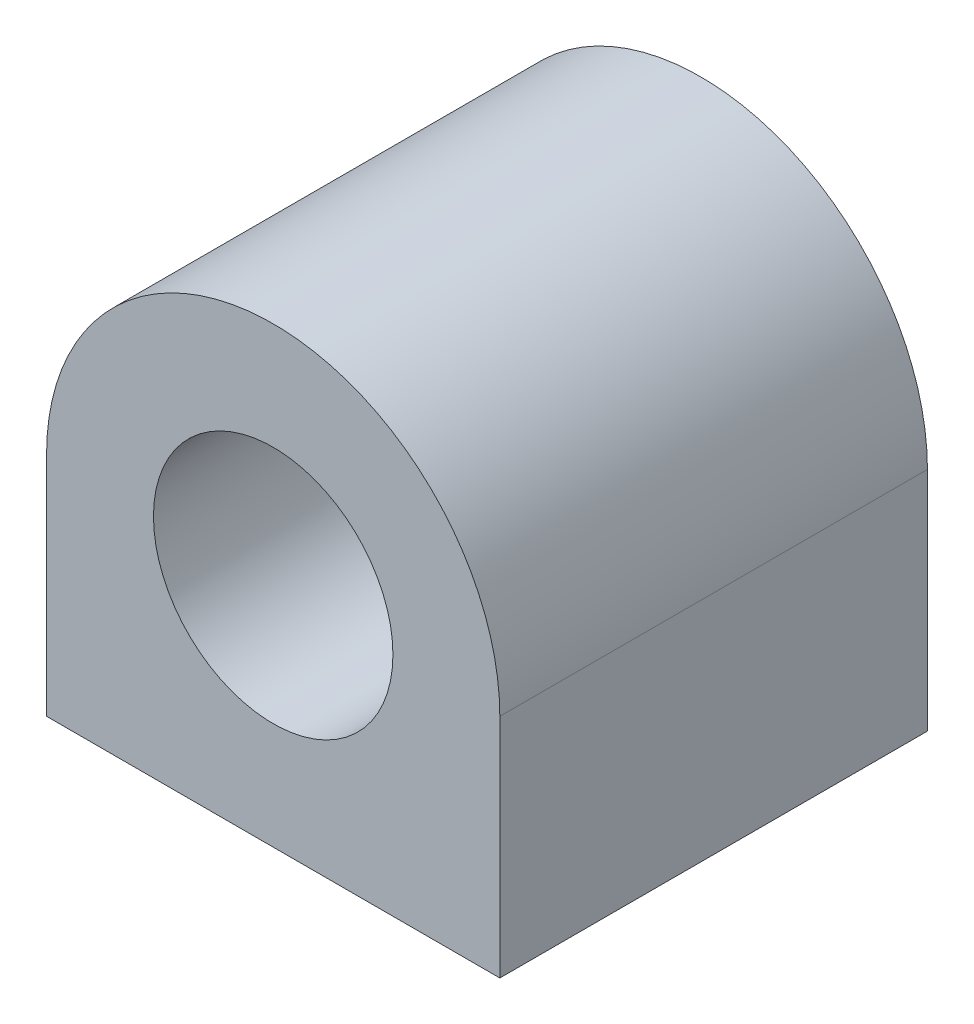
ISO-10303-21;
HEADER;
FILE_DESCRIPTION(('STEP AP214'),'2;1');
FILE_NAME('part.step','',(''),(''),'','','');
FILE_SCHEMA(('AUTOMOTIVE_DESIGN { 1 0 10303 214 1 1 1 1 }'));
ENDSEC;
DATA;
#1=APPLICATION_CONTEXT('core data for automotive mechanical design processes');
#2=APPLICATION_PROTOCOL_DEFINITION('international standard','automotive_design',2000,#1);
#3=PRODUCT_CONTEXT('',#1,'mechanical');
#4=PRODUCT('Part','Part','',(#3));
#5=PRODUCT_RELATED_PRODUCT_CATEGORY('part','',(#4));
#6=PRODUCT_DEFINITION_FORMATION('','',#4);
#7=PRODUCT_DEFINITION_CONTEXT('part definition',#1,'design');
#8=PRODUCT_DEFINITION('design','',#6,#7);
#9=PRODUCT_DEFINITION_SHAPE('','',#8);
#10=(LENGTH_UNIT() NAMED_UNIT(*) SI_UNIT(.MILLI.,.METRE.));
#11=(NAMED_UNIT(*) PLANE_ANGLE_UNIT() SI_UNIT($,.RADIAN.));
#12=(NAMED_UNIT(*) SI_UNIT($,.STERADIAN.) SOLID_ANGLE_UNIT());
#13=UNCERTAINTY_MEASURE_WITH_UNIT(LENGTH_MEASURE(1.E-05),#10,'distance_accuracy_value','');
#14=(GEOMETRIC_REPRESENTATION_CONTEXT(3) GLOBAL_UNCERTAINTY_ASSIGNED_CONTEXT((#13)) GLOBAL_UNIT_ASSIGNED_CONTEXT((#10,
#11,#12)) REPRESENTATION_CONTEXT('',''));
#15=CARTESIAN_POINT('',(0.,0.,0.));
#16=DIRECTION('',(0.,0.,1.));
#17=DIRECTION('',(1.,0.,0.));
#18=AXIS2_PLACEMENT_3D('',#15,#16,#17);
#19=CARTESIAN_POINT('',(0.,0.,10.));
#20=DIRECTION('',(0.,0.,1.));
#21=DIRECTION('',(1.,0.,0.));
#22=AXIS2_PLACEMENT_3D('',#19,#20,#21);
#23=PLANE('',#22);
#24=CARTESIAN_POINT('',(0.,0.,10.));
#25=DIRECTION('',(0.,0.,1.));
#26=DIRECTION('',(1.,0.,0.));
#27=AXIS2_PLACEMENT_3D('',#24,#25,#26);
#28=CIRCLE('',#27,10.6);
#29=CARTESIAN_POINT('',(10.6,0.,10.));
#30=VERTEX_POINT('',#29);
#31=CARTESIAN_POINT('',(-10.6,0.,10.));
#32=VERTEX_POINT('',#31);
#33=EDGE_CURVE('E85',#30,#32,#28,.T.);
#34=ORIENTED_EDGE('',*,*,#33,.T.);
#35=DIRECTION('',(0.,-1.,0.));
#36=VECTOR('',#35,1.);
#37=CARTESIAN_POINT('',(-10.6,0.,10.));
#38=LINE('',#37,#36);
#39=CARTESIAN_POINT('',(-10.6,-10.6,10.));
#40=VERTEX_POINT('',#39);
#41=EDGE_CURVE('E80',#32,#40,#38,.T.);
#42=ORIENTED_EDGE('',*,*,#41,.T.);
#43=DIRECTION('',(1.,0.,0.));
#44=VECTOR('',#43,1.);
#45=CARTESIAN_POINT('',(-10.6,-10.6,10.));
#46=LINE('',#45,#44);
#47=CARTESIAN_POINT('',(10.6,-10.6,10.));
#48=VERTEX_POINT('',#47);
#49=EDGE_CURVE('E83',#40,#48,#46,.T.);
#50=ORIENTED_EDGE('',*,*,#49,.T.);
#51=DIRECTION('',(0.,1.,0.));
#52=VECTOR('',#51,1.);
#53=CARTESIAN_POINT('',(10.6,-10.6,10.));
#54=LINE('',#53,#52);
#55=EDGE_CURVE('E50',#48,#30,#54,.T.);
#56=ORIENTED_EDGE('',*,*,#55,.T.);
#57=EDGE_LOOP('',(#34,#42,#50,#56));
#58=FACE_BOUND('',#57,.T.);
#59=CARTESIAN_POINT('',(0.,0.,10.));
#60=DIRECTION('',(0.,0.,1.));
#61=DIRECTION('',(1.,0.,0.));
#62=AXIS2_PLACEMENT_3D('',#59,#60,#61);
#63=CIRCLE('',#62,5.6);
#64=CARTESIAN_POINT('',(5.6,0.,10.));
#65=VERTEX_POINT('',#64);
#66=EDGE_CURVE('E100',#65,#65,#63,.T.);
#67=ORIENTED_EDGE('',*,*,#66,.F.);
#68=EDGE_LOOP('',(#67));
#69=FACE_BOUND('',#68,.T.);
#70=ADVANCED_FACE('F33',(#58,#69),#23,.T.);
#71=CARTESIAN_POINT('',(0.,0.,-10.));
#72=DIRECTION('',(0.,0.,1.));
#73=DIRECTION('',(1.,0.,0.));
#74=AXIS2_PLACEMENT_3D('',#71,#72,#73);
#75=PLANE('',#74);
#76=CARTESIAN_POINT('',(0.,0.,-10.));
#77=DIRECTION('',(0.,0.,1.));
#78=DIRECTION('',(1.,0.,0.));
#79=AXIS2_PLACEMENT_3D('',#76,#77,#78);
#80=CIRCLE('',#79,10.6);
#81=CARTESIAN_POINT('',(10.6,0.,-10.));
#82=VERTEX_POINT('',#81);
#83=CARTESIAN_POINT('',(-10.6,0.,-10.));
#84=VERTEX_POINT('',#83);
#85=EDGE_CURVE('E97',#82,#84,#80,.T.);
#86=ORIENTED_EDGE('',*,*,#85,.F.);
#87=DIRECTION('',(0.,1.,0.));
#88=VECTOR('',#87,1.);
#89=CARTESIAN_POINT('',(10.6,-10.6,-10.));
#90=LINE('',#89,#88);
#91=CARTESIAN_POINT('',(10.6,-10.6,-10.));
#92=VERTEX_POINT('',#91);
#93=EDGE_CURVE('E73',#92,#82,#90,.T.);
#94=ORIENTED_EDGE('',*,*,#93,.F.);
#95=DIRECTION('',(1.,0.,0.));
#96=VECTOR('',#95,1.);
#97=CARTESIAN_POINT('',(-10.6,-10.6,-10.));
#98=LINE('',#97,#96);
#99=CARTESIAN_POINT('',(-10.6,-10.6,-10.));
#100=VERTEX_POINT('',#99);
#101=EDGE_CURVE('E67',#100,#92,#98,.T.);
#102=ORIENTED_EDGE('',*,*,#101,.F.);
#103=DIRECTION('',(0.,-1.,0.));
#104=VECTOR('',#103,1.);
#105=CARTESIAN_POINT('',(-10.6,0.,-10.));
#106=LINE('',#105,#104);
#107=EDGE_CURVE('E89',#84,#100,#106,.T.);
#108=ORIENTED_EDGE('',*,*,#107,.F.);
#109=EDGE_LOOP('',(#86,#94,#102,#108));
#110=FACE_BOUND('',#109,.T.);
#111=CARTESIAN_POINT('',(0.,0.,-10.));
#112=DIRECTION('',(0.,0.,1.));
#113=DIRECTION('',(1.,0.,0.));
#114=AXIS2_PLACEMENT_3D('',#111,#112,#113);
#115=CIRCLE('',#114,5.6);
#116=CARTESIAN_POINT('',(5.6,0.,-10.));
#117=VERTEX_POINT('',#116);
#118=EDGE_CURVE('E112',#117,#117,#115,.T.);
#119=ORIENTED_EDGE('',*,*,#118,.T.);
#120=EDGE_LOOP('',(#119));
#121=FACE_BOUND('',#120,.T.);
#122=ADVANCED_FACE('F108',(#110,#121),#75,.F.);
#123=CARTESIAN_POINT('',(0.,0.,10.));
#124=DIRECTION('',(0.,0.,-1.));
#125=DIRECTION('',(-1.,0.,0.));
#126=AXIS2_PLACEMENT_3D('',#123,#124,#125);
#127=CYLINDRICAL_SURFACE('',#126,10.6);
#128=ORIENTED_EDGE('',*,*,#85,.T.);
#129=DIRECTION('',(0.,0.,-1.));
#130=VECTOR('',#129,1.);
#131=CARTESIAN_POINT('',(-10.6,0.,10.));
#132=LINE('',#131,#130);
#133=EDGE_CURVE('E11',#32,#84,#132,.T.);
#134=ORIENTED_EDGE('',*,*,#133,.F.);
#135=ORIENTED_EDGE('',*,*,#33,.F.);
#136=DIRECTION('',(0.,0.,-1.));
#137=VECTOR('',#136,1.);
#138=CARTESIAN_POINT('',(10.6,0.,10.));
#139=LINE('',#138,#137);
#140=EDGE_CURVE('E93',#30,#82,#139,.T.);
#141=ORIENTED_EDGE('',*,*,#140,.T.);
#142=EDGE_LOOP('',(#128,#134,#135,#141));
#143=FACE_BOUND('',#142,.T.);
#144=ADVANCED_FACE('F35',(#143),#127,.T.);
#145=CARTESIAN_POINT('',(-10.6,0.,10.));
#146=DIRECTION('',(1.,0.,0.));
#147=DIRECTION('',(0.,1.,0.));
#148=AXIS2_PLACEMENT_3D('',#145,#146,#147);
#149=PLANE('',#148);
#150=ORIENTED_EDGE('',*,*,#107,.T.);
#151=DIRECTION('',(0.,0.,-1.));
#152=VECTOR('',#151,1.);
#153=CARTESIAN_POINT('',(-10.6,-10.6,10.));
#154=LINE('',#153,#152);
#155=EDGE_CURVE('E42',#40,#100,#154,.T.);
#156=ORIENTED_EDGE('',*,*,#155,.F.);
#157=ORIENTED_EDGE('',*,*,#41,.F.);
#158=ORIENTED_EDGE('',*,*,#133,.T.);
#159=EDGE_LOOP('',(#150,#156,#157,#158));
#160=FACE_BOUND('',#159,.T.);
#161=ADVANCED_FACE('F88',(#160),#149,.F.);
#162=CARTESIAN_POINT('',(-10.6,-10.6,10.));
#163=DIRECTION('',(0.,1.,0.));
#164=DIRECTION('',(0.,0.,1.));
#165=AXIS2_PLACEMENT_3D('',#162,#163,#164);
#166=PLANE('',#165);
#167=CARTESIAN_POINT('',(-7.5,-10.6,0.));
#168=DIRECTION('',(0.,-1.,0.));
#169=DIRECTION('',(0.,0.,-1.));
#170=AXIS2_PLACEMENT_3D('',#167,#168,#169);
#171=CIRCLE('',#170,1.2);
#172=CARTESIAN_POINT('',(-7.5,-10.6,-1.2));
#173=VERTEX_POINT('',#172);
#174=EDGE_CURVE('E124',#173,#173,#171,.T.);
#175=ORIENTED_EDGE('',*,*,#174,.F.);
#176=EDGE_LOOP('',(#175));
#177=FACE_BOUND('',#176,.T.);
#178=CARTESIAN_POINT('',(7.5,-10.6,0.));
#179=DIRECTION('',(0.,-1.,0.));
#180=DIRECTION('',(0.,0.,1.));
#181=AXIS2_PLACEMENT_3D('',#178,#179,#180);
#182=CIRCLE('',#181,1.2);
#183=CARTESIAN_POINT('',(7.5,-10.6,1.2));
#184=VERTEX_POINT('',#183);
#185=EDGE_CURVE('E118',#184,#184,#182,.T.);
#186=ORIENTED_EDGE('',*,*,#185,.F.);
#187=EDGE_LOOP('',(#186));
#188=FACE_BOUND('',#187,.T.);
#189=ORIENTED_EDGE('',*,*,#101,.T.);
#190=DIRECTION('',(0.,0.,-1.));
#191=VECTOR('',#190,1.);
#192=CARTESIAN_POINT('',(10.6,-10.6,10.));
#193=LINE('',#192,#191);
#194=EDGE_CURVE('E90',#48,#92,#193,.T.);
#195=ORIENTED_EDGE('',*,*,#194,.F.);
#196=ORIENTED_EDGE('',*,*,#49,.F.);
#197=ORIENTED_EDGE('',*,*,#155,.T.);
#198=EDGE_LOOP('',(#189,#195,#196,#197));
#199=FACE_BOUND('',#198,.T.);
#200=ADVANCED_FACE('F91',(#177,#188,#199),#166,.F.);
#201=CARTESIAN_POINT('',(10.6,-10.6,10.));
#202=DIRECTION('',(-1.,0.,0.));
#203=DIRECTION('',(0.,-1.,0.));
#204=AXIS2_PLACEMENT_3D('',#201,#202,#203);
#205=PLANE('',#204);
#206=ORIENTED_EDGE('',*,*,#93,.T.);
#207=ORIENTED_EDGE('',*,*,#140,.F.);
#208=ORIENTED_EDGE('',*,*,#55,.F.);
#209=ORIENTED_EDGE('',*,*,#194,.T.);
#210=EDGE_LOOP('',(#206,#207,#208,#209));
#211=FACE_BOUND('',#210,.T.);
#212=ADVANCED_FACE('F105',(#211),#205,.F.);
#213=CARTESIAN_POINT('',(0.,0.,10.));
#214=DIRECTION('',(0.,0.,-1.));
#215=DIRECTION('',(-1.,0.,0.));
#216=AXIS2_PLACEMENT_3D('',#213,#214,#215);
#217=CYLINDRICAL_SURFACE('',#216,5.6);
#218=ORIENTED_EDGE('',*,*,#66,.T.);
#219=EDGE_LOOP('',(#218));
#220=FACE_BOUND('',#219,.T.);
#221=ORIENTED_EDGE('',*,*,#118,.F.);
#222=EDGE_LOOP('',(#221));
#223=FACE_BOUND('',#222,.T.);
#224=ADVANCED_FACE('F146',(#220,#223),#217,.F.);
#225=CARTESIAN_POINT('',(7.5,0.399999999999999,0.));
#226=DIRECTION('',(0.,-1.,0.));
#227=DIRECTION('',(0.,0.,-1.));
#228=AXIS2_PLACEMENT_3D('',#225,#226,#227);
#229=CYLINDRICAL_SURFACE('',#228,1.2);
#230=CARTESIAN_POINT('',(7.5,0.399999999999999,0.));
#231=DIRECTION('',(0.,-1.,0.));
#232=DIRECTION('',(0.,0.,1.));
#233=AXIS2_PLACEMENT_3D('',#230,#231,#232);
#234=CIRCLE('',#233,1.2);
#235=CARTESIAN_POINT('',(7.5,0.399999999999999,1.2));
#236=VERTEX_POINT('',#235);
#237=EDGE_CURVE('E121',#236,#236,#234,.T.);
#238=ORIENTED_EDGE('',*,*,#237,.F.);
#239=EDGE_LOOP('',(#238));
#240=FACE_BOUND('',#239,.T.);
#241=ORIENTED_EDGE('',*,*,#185,.T.);
#242=EDGE_LOOP('',(#241));
#243=FACE_BOUND('',#242,.T.);
#244=ADVANCED_FACE('F144',(#240,#243),#229,.F.);
#245=CARTESIAN_POINT('',(7.5,0.399999999999999,0.));
#246=DIRECTION('',(0.,1.,0.));
#247=DIRECTION('',(0.,0.,1.));
#248=AXIS2_PLACEMENT_3D('',#245,#246,#247);
#249=PLANE('',#248);
#250=ORIENTED_EDGE('',*,*,#237,.T.);
#251=EDGE_LOOP('',(#250));
#252=FACE_BOUND('',#251,.T.);
#253=ADVANCED_FACE('F135',(#252),#249,.F.);
#254=CARTESIAN_POINT('',(-7.5,0.399999999999999,0.));
#255=DIRECTION('',(0.,-1.,0.));
#256=DIRECTION('',(0.,0.,-1.));
#257=AXIS2_PLACEMENT_3D('',#254,#255,#256);
#258=CYLINDRICAL_SURFACE('',#257,1.2);
#259=CARTESIAN_POINT('',(-7.5,0.399999999999999,0.));
#260=DIRECTION('',(0.,-1.,0.));
#261=DIRECTION('',(0.,0.,-1.));
#262=AXIS2_PLACEMENT_3D('',#259,#260,#261);
#263=CIRCLE('',#262,1.2);
#264=CARTESIAN_POINT('',(-7.5,0.399999999999999,-1.2));
#265=VERTEX_POINT('',#264);
#266=EDGE_CURVE('E115',#265,#265,#263,.T.);
#267=ORIENTED_EDGE('',*,*,#266,.F.);
#268=EDGE_LOOP('',(#267));
#269=FACE_BOUND('',#268,.T.);
#270=ORIENTED_EDGE('',*,*,#174,.T.);
#271=EDGE_LOOP('',(#270));
#272=FACE_BOUND('',#271,.T.);
#273=ADVANCED_FACE('F132',(#269,#272),#258,.F.);
#274=CARTESIAN_POINT('',(-7.5,0.399999999999999,0.));
#275=DIRECTION('',(0.,-1.,0.));
#276=DIRECTION('',(0.,0.,-1.));
#277=AXIS2_PLACEMENT_3D('',#274,#275,#276);
#278=PLANE('',#277);
#279=ORIENTED_EDGE('',*,*,#266,.T.);
#280=EDGE_LOOP('',(#279));
#281=FACE_BOUND('',#280,.T.);
#282=ADVANCED_FACE('F130',(#281),#278,.T.);
#283=CLOSED_SHELL('',(#70,#122,#144,#161,#200,#212,#224,#244,#253,#273,#282));
#284=MANIFOLD_SOLID_BREP('B2',#283);
#285=ADVANCED_BREP_SHAPE_REPRESENTATION('',(#18,#284),#14);
#286=SHAPE_DEFINITION_REPRESENTATION(#9,#285);
ENDSEC;
END-ISO-10303-21;
